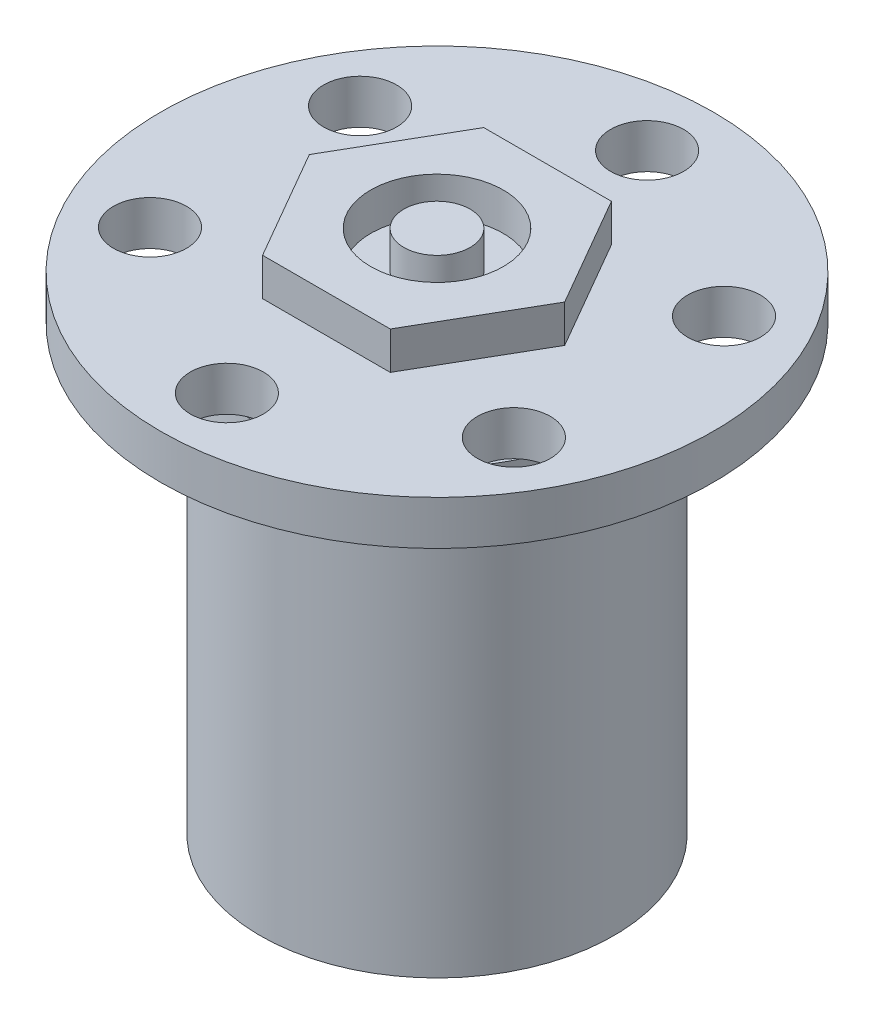
ISO-10303-21;
HEADER;
FILE_DESCRIPTION(('STEP AP214'),'2;1');
FILE_NAME('part.step','',(''),(''),'','','');
FILE_SCHEMA(('AUTOMOTIVE_DESIGN { 1 0 10303 214 1 1 1 1 }'));
ENDSEC;
DATA;
#1=APPLICATION_CONTEXT('core data for automotive mechanical design processes');
#2=APPLICATION_PROTOCOL_DEFINITION('international standard','automotive_design',2000,#1);
#3=PRODUCT_CONTEXT('',#1,'mechanical');
#4=PRODUCT('Part','Part','',(#3));
#5=PRODUCT_RELATED_PRODUCT_CATEGORY('part','',(#4));
#6=PRODUCT_DEFINITION_FORMATION('','',#4);
#7=PRODUCT_DEFINITION_CONTEXT('part definition',#1,'design');
#8=PRODUCT_DEFINITION('design','',#6,#7);
#9=PRODUCT_DEFINITION_SHAPE('','',#8);
#10=(LENGTH_UNIT() NAMED_UNIT(*) SI_UNIT(.MILLI.,.METRE.));
#11=(NAMED_UNIT(*) PLANE_ANGLE_UNIT() SI_UNIT($,.RADIAN.));
#12=(NAMED_UNIT(*) SI_UNIT($,.STERADIAN.) SOLID_ANGLE_UNIT());
#13=UNCERTAINTY_MEASURE_WITH_UNIT(LENGTH_MEASURE(1.E-05),#10,'distance_accuracy_value','');
#14=(GEOMETRIC_REPRESENTATION_CONTEXT(3) GLOBAL_UNCERTAINTY_ASSIGNED_CONTEXT((#13)) GLOBAL_UNIT_ASSIGNED_CONTEXT((#10,
#11,#12)) REPRESENTATION_CONTEXT('',''));
#15=CARTESIAN_POINT('',(0.,0.,0.));
#16=DIRECTION('',(0.,0.,1.));
#17=DIRECTION('',(1.,0.,0.));
#18=AXIS2_PLACEMENT_3D('',#15,#16,#17);
#19=CARTESIAN_POINT('',(0.,2.,0.));
#20=DIRECTION('',(0.,-1.,0.));
#21=DIRECTION('',(0.,0.,-1.));
#22=AXIS2_PLACEMENT_3D('',#19,#20,#21);
#23=CYLINDRICAL_SURFACE('',#22,12.5);
#24=CARTESIAN_POINT('',(0.,2.,0.));
#25=DIRECTION('',(0.,1.,0.));
#26=DIRECTION('',(0.,0.,1.));
#27=AXIS2_PLACEMENT_3D('',#24,#25,#26);
#28=CIRCLE('',#27,12.5);
#29=CARTESIAN_POINT('',(0.,2.,12.5));
#30=VERTEX_POINT('',#29);
#31=EDGE_CURVE('E201',#30,#30,#28,.T.);
#32=ORIENTED_EDGE('',*,*,#31,.F.);
#33=EDGE_LOOP('',(#32));
#34=FACE_BOUND('',#33,.T.);
#35=CARTESIAN_POINT('',(0.,0.,0.));
#36=DIRECTION('',(0.,1.,0.));
#37=DIRECTION('',(0.,0.,1.));
#38=AXIS2_PLACEMENT_3D('',#35,#36,#37);
#39=CIRCLE('',#38,12.5);
#40=CARTESIAN_POINT('',(0.,0.,12.5));
#41=VERTEX_POINT('',#40);
#42=EDGE_CURVE('E39',#41,#41,#39,.T.);
#43=ORIENTED_EDGE('',*,*,#42,.T.);
#44=EDGE_LOOP('',(#43));
#45=FACE_BOUND('',#44,.T.);
#46=ADVANCED_FACE('F36',(#34,#45),#23,.T.);
#47=CARTESIAN_POINT('',(0.,2.,0.));
#48=DIRECTION('',(0.,1.,0.));
#49=DIRECTION('',(0.,0.,1.));
#50=AXIS2_PLACEMENT_3D('',#47,#48,#49);
#51=PLANE('',#50);
#52=DIRECTION('',(-0.5,0.,0.866025403784439));
#53=VECTOR('',#52,1.);
#54=CARTESIAN_POINT('',(-2.88675134594813,2.,-5.));
#55=LINE('',#54,#53);
#56=CARTESIAN_POINT('',(-2.88675134594813,2.,-5.));
#57=VERTEX_POINT('',#56);
#58=CARTESIAN_POINT('',(-5.77350269189626,2.,0.));
#59=VERTEX_POINT('',#58);
#60=EDGE_CURVE('E53',#57,#59,#55,.T.);
#61=ORIENTED_EDGE('',*,*,#60,.F.);
#62=DIRECTION('',(-1.,0.,0.));
#63=VECTOR('',#62,1.);
#64=CARTESIAN_POINT('',(2.88675134594813,2.,-5.));
#65=LINE('',#64,#63);
#66=CARTESIAN_POINT('',(2.88675134594813,2.,-5.));
#67=VERTEX_POINT('',#66);
#68=EDGE_CURVE('E57',#67,#57,#65,.T.);
#69=ORIENTED_EDGE('',*,*,#68,.F.);
#70=DIRECTION('',(-0.5,0.,-0.866025403784439));
#71=VECTOR('',#70,1.);
#72=CARTESIAN_POINT('',(5.77350269189626,2.,0.));
#73=LINE('',#72,#71);
#74=CARTESIAN_POINT('',(5.77350269189626,2.,0.));
#75=VERTEX_POINT('',#74);
#76=EDGE_CURVE('E565',#75,#67,#73,.T.);
#77=ORIENTED_EDGE('',*,*,#76,.F.);
#78=DIRECTION('',(0.5,0.,-0.866025403784439));
#79=VECTOR('',#78,1.);
#80=CARTESIAN_POINT('',(2.88675134594813,2.,5.));
#81=LINE('',#80,#79);
#82=CARTESIAN_POINT('',(2.88675134594813,2.,5.));
#83=VERTEX_POINT('',#82);
#84=EDGE_CURVE('E562',#83,#75,#81,.T.);
#85=ORIENTED_EDGE('',*,*,#84,.F.);
#86=DIRECTION('',(1.,0.,0.));
#87=VECTOR('',#86,1.);
#88=CARTESIAN_POINT('',(-2.88675134594813,2.,5.));
#89=LINE('',#88,#87);
#90=CARTESIAN_POINT('',(-2.88675134594813,2.,5.));
#91=VERTEX_POINT('',#90);
#92=EDGE_CURVE('E559',#91,#83,#89,.T.);
#93=ORIENTED_EDGE('',*,*,#92,.F.);
#94=DIRECTION('',(0.5,0.,0.866025403784439));
#95=VECTOR('',#94,1.);
#96=CARTESIAN_POINT('',(-5.77350269189626,2.,0.));
#97=LINE('',#96,#95);
#98=EDGE_CURVE('E557',#59,#91,#97,.T.);
#99=ORIENTED_EDGE('',*,*,#98,.F.);
#100=EDGE_LOOP('',(#61,#69,#77,#85,#93,#99));
#101=FACE_BOUND('',#100,.T.);
#102=CARTESIAN_POINT('',(8.22724133595211,2.,-4.7500000000001));
#103=DIRECTION('',(0.,-1.,0.));
#104=DIRECTION('',(0.866025403784433,0.,-0.50000000000001));
#105=AXIS2_PLACEMENT_3D('',#102,#103,#104);
#106=CIRCLE('',#105,1.65);
#107=CARTESIAN_POINT('',(9.65618325219643,2.,-5.57500000000011));
#108=VERTEX_POINT('',#107);
#109=EDGE_CURVE('E184',#108,#108,#106,.T.);
#110=ORIENTED_EDGE('',*,*,#109,.T.);
#111=EDGE_LOOP('',(#110));
#112=FACE_BOUND('',#111,.T.);
#113=CARTESIAN_POINT('',(8.22724133595221,2.,4.74999999999992));
#114=DIRECTION('',(0.,-1.,0.));
#115=DIRECTION('',(0.866025403784443,0.,0.499999999999992));
#116=AXIS2_PLACEMENT_3D('',#113,#114,#115);
#117=CIRCLE('',#116,1.65);
#118=CARTESIAN_POINT('',(9.65618325219654,2.,5.57499999999991));
#119=VERTEX_POINT('',#118);
#120=EDGE_CURVE('E177',#119,#119,#117,.T.);
#121=ORIENTED_EDGE('',*,*,#120,.T.);
#122=EDGE_LOOP('',(#121));
#123=FACE_BOUND('',#122,.T.);
#124=CARTESIAN_POINT('',(0.,2.,9.5));
#125=DIRECTION('',(0.,-1.,0.));
#126=DIRECTION('',(0.,0.,1.));
#127=AXIS2_PLACEMENT_3D('',#124,#125,#126);
#128=CIRCLE('',#127,1.65);
#129=CARTESIAN_POINT('',(0.,2.,11.15));
#130=VERTEX_POINT('',#129);
#131=EDGE_CURVE('E170',#130,#130,#128,.T.);
#132=ORIENTED_EDGE('',*,*,#131,.T.);
#133=EDGE_LOOP('',(#132));
#134=FACE_BOUND('',#133,.T.);
#135=CARTESIAN_POINT('',(-8.22724133595215,2.,4.75000000000004));
#136=DIRECTION('',(0.,-1.,0.));
#137=DIRECTION('',(-0.866025403784436,0.,0.500000000000004));
#138=AXIS2_PLACEMENT_3D('',#135,#136,#137);
#139=CIRCLE('',#138,1.65);
#140=CARTESIAN_POINT('',(-9.65618325219647,2.,5.57500000000005));
#141=VERTEX_POINT('',#140);
#142=EDGE_CURVE('E162',#141,#141,#139,.T.);
#143=ORIENTED_EDGE('',*,*,#142,.T.);
#144=EDGE_LOOP('',(#143));
#145=FACE_BOUND('',#144,.T.);
#146=CARTESIAN_POINT('',(-8.22724133595218,2.,-4.74999999999998));
#147=DIRECTION('',(0.,-1.,0.));
#148=DIRECTION('',(-0.86602540378444,0.,-0.499999999999998));
#149=AXIS2_PLACEMENT_3D('',#146,#147,#148);
#150=CIRCLE('',#149,1.65);
#151=CARTESIAN_POINT('',(-9.6561832521965,2.,-5.57499999999998));
#152=VERTEX_POINT('',#151);
#153=EDGE_CURVE('E190',#152,#152,#150,.T.);
#154=ORIENTED_EDGE('',*,*,#153,.T.);
#155=EDGE_LOOP('',(#154));
#156=FACE_BOUND('',#155,.T.);
#157=CARTESIAN_POINT('',(0.,2.,-9.5));
#158=DIRECTION('',(0.,-1.,0.));
#159=DIRECTION('',(0.,0.,-1.));
#160=AXIS2_PLACEMENT_3D('',#157,#158,#159);
#161=CIRCLE('',#160,1.65);
#162=CARTESIAN_POINT('',(0.,2.,-11.15));
#163=VERTEX_POINT('',#162);
#164=EDGE_CURVE('E197',#163,#163,#161,.T.);
#165=ORIENTED_EDGE('',*,*,#164,.T.);
#166=EDGE_LOOP('',(#165));
#167=FACE_BOUND('',#166,.T.);
#168=ORIENTED_EDGE('',*,*,#31,.T.);
#169=EDGE_LOOP('',(#168));
#170=FACE_BOUND('',#169,.T.);
#171=ADVANCED_FACE('F214',(#101,#112,#123,#134,#145,#156,#167,#170),#51,.T.);
#172=CARTESIAN_POINT('',(0.,0.,0.));
#173=DIRECTION('',(0.,1.,0.));
#174=DIRECTION('',(0.,0.,1.));
#175=AXIS2_PLACEMENT_3D('',#172,#173,#174);
#176=PLANE('',#175);
#177=CARTESIAN_POINT('',(0.,0.,0.));
#178=DIRECTION('',(0.,-1.,0.));
#179=DIRECTION('',(0.,0.,-1.));
#180=AXIS2_PLACEMENT_3D('',#177,#178,#179);
#181=CIRCLE('',#180,8.);
#182=CARTESIAN_POINT('',(0.630298578831062,0.,-7.97513157894737));
#183=VERTEX_POINT('',#182);
#184=CARTESIAN_POINT('',(6.59151725647634,0.,-4.53342037071069));
#185=VERTEX_POINT('',#184);
#186=EDGE_CURVE('E151',#183,#185,#181,.T.);
#187=ORIENTED_EDGE('',*,*,#186,.F.);
#188=CARTESIAN_POINT('',(0.,0.,-9.5));
#189=DIRECTION('',(0.,-1.,0.));
#190=DIRECTION('',(0.,0.,-1.));
#191=AXIS2_PLACEMENT_3D('',#188,#189,#190);
#192=CIRCLE('',#191,1.65);
#193=CARTESIAN_POINT('',(-0.630298578831062,0.,-7.97513157894737));
#194=VERTEX_POINT('',#193);
#195=EDGE_CURVE('E193',#194,#183,#192,.T.);
#196=ORIENTED_EDGE('',*,*,#195,.F.);
#197=CARTESIAN_POINT('',(-6.5915172564764,0.,-4.5334203707106));
#198=VERTEX_POINT('',#197);
#199=EDGE_CURVE('E161',#198,#194,#181,.T.);
#200=ORIENTED_EDGE('',*,*,#199,.F.);
#201=CARTESIAN_POINT('',(-8.22724133595218,0.,-4.74999999999998));
#202=DIRECTION('',(0.,-1.,0.));
#203=DIRECTION('',(-0.86602540378444,0.,-0.499999999999998));
#204=AXIS2_PLACEMENT_3D('',#201,#202,#203);
#205=CIRCLE('',#204,1.65);
#206=CARTESIAN_POINT('',(-7.22181583530746,0.,-3.44171120823674));
#207=VERTEX_POINT('',#206);
#208=EDGE_CURVE('E165',#207,#198,#205,.T.);
#209=ORIENTED_EDGE('',*,*,#208,.F.);
#210=CARTESIAN_POINT('',(-7.22181583530744,0.,3.44171120823679));
#211=VERTEX_POINT('',#210);
#212=EDGE_CURVE('E206',#211,#207,#181,.T.);
#213=ORIENTED_EDGE('',*,*,#212,.F.);
#214=CARTESIAN_POINT('',(-8.22724133595215,0.,4.75000000000004));
#215=DIRECTION('',(0.,-1.,0.));
#216=DIRECTION('',(-0.866025403784436,0.,0.500000000000004));
#217=AXIS2_PLACEMENT_3D('',#214,#215,#216);
#218=CIRCLE('',#217,1.65);
#219=CARTESIAN_POINT('',(-6.59151725647637,0.,4.53342037071064));
#220=VERTEX_POINT('',#219);
#221=EDGE_CURVE('E169',#220,#211,#218,.T.);
#222=ORIENTED_EDGE('',*,*,#221,.F.);
#223=CARTESIAN_POINT('',(-0.630298578831062,0.,7.97513157894737));
#224=VERTEX_POINT('',#223);
#225=EDGE_CURVE('E395',#224,#220,#181,.T.);
#226=ORIENTED_EDGE('',*,*,#225,.F.);
#227=CARTESIAN_POINT('',(0.,0.,9.5));
#228=DIRECTION('',(0.,-1.,0.));
#229=DIRECTION('',(0.,0.,1.));
#230=AXIS2_PLACEMENT_3D('',#227,#228,#229);
#231=CIRCLE('',#230,1.65);
#232=CARTESIAN_POINT('',(0.630298578831062,0.,7.97513157894737));
#233=VERTEX_POINT('',#232);
#234=EDGE_CURVE('E176',#233,#224,#231,.T.);
#235=ORIENTED_EDGE('',*,*,#234,.F.);
#236=CARTESIAN_POINT('',(6.59151725647643,0.,4.53342037071055));
#237=VERTEX_POINT('',#236);
#238=EDGE_CURVE('E44',#237,#233,#181,.T.);
#239=ORIENTED_EDGE('',*,*,#238,.F.);
#240=CARTESIAN_POINT('',(8.22724133595221,0.,4.74999999999992));
#241=DIRECTION('',(0.,-1.,0.));
#242=DIRECTION('',(0.866025403784443,0.,0.499999999999992));
#243=AXIS2_PLACEMENT_3D('',#240,#241,#242);
#244=CIRCLE('',#243,1.65);
#245=CARTESIAN_POINT('',(7.22181583530749,0.,3.44171120823669));
#246=VERTEX_POINT('',#245);
#247=EDGE_CURVE('E183',#246,#237,#244,.T.);
#248=ORIENTED_EDGE('',*,*,#247,.F.);
#249=CARTESIAN_POINT('',(7.22181583530741,0.,-3.44171120823684));
#250=VERTEX_POINT('',#249);
#251=EDGE_CURVE('E11',#250,#246,#181,.T.);
#252=ORIENTED_EDGE('',*,*,#251,.F.);
#253=CARTESIAN_POINT('',(8.22724133595211,0.,-4.7500000000001));
#254=DIRECTION('',(0.,-1.,0.));
#255=DIRECTION('',(0.866025403784433,0.,-0.50000000000001));
#256=AXIS2_PLACEMENT_3D('',#253,#254,#255);
#257=CIRCLE('',#256,1.65);
#258=EDGE_CURVE('E158',#185,#250,#257,.T.);
#259=ORIENTED_EDGE('',*,*,#258,.F.);
#260=EDGE_LOOP('',(#187,#196,#200,#209,#213,#222,#226,#235,#239,#248,#252,#259));
#261=FACE_BOUND('',#260,.T.);
#262=ORIENTED_EDGE('',*,*,#42,.F.);
#263=EDGE_LOOP('',(#262));
#264=FACE_BOUND('',#263,.T.);
#265=ADVANCED_FACE('F211',(#261,#264),#176,.F.);
#266=CARTESIAN_POINT('',(0.,2.,-9.5));
#267=DIRECTION('',(0.,-1.,0.));
#268=DIRECTION('',(0.,0.,-1.));
#269=AXIS2_PLACEMENT_3D('',#266,#267,#268);
#270=CYLINDRICAL_SURFACE('',#269,1.65);
#271=ORIENTED_EDGE('',*,*,#164,.F.);
#272=EDGE_LOOP('',(#271));
#273=FACE_BOUND('',#272,.T.);
#274=EDGE_CURVE('E200',#183,#194,#192,.T.);
#275=ORIENTED_EDGE('',*,*,#274,.T.);
#276=ORIENTED_EDGE('',*,*,#195,.T.);
#277=EDGE_LOOP('',(#275,#276));
#278=FACE_BOUND('',#277,.T.);
#279=ADVANCED_FACE('F213',(#273,#278),#270,.F.);
#280=CARTESIAN_POINT('',(-8.22724133595218,2.,-4.74999999999998));
#281=DIRECTION('',(0.,-1.,0.));
#282=DIRECTION('',(0.,0.,-1.));
#283=AXIS2_PLACEMENT_3D('',#280,#281,#282);
#284=CYLINDRICAL_SURFACE('',#283,1.65);
#285=ORIENTED_EDGE('',*,*,#153,.F.);
#286=EDGE_LOOP('',(#285));
#287=FACE_BOUND('',#286,.T.);
#288=EDGE_CURVE('E194',#198,#207,#205,.T.);
#289=ORIENTED_EDGE('',*,*,#288,.T.);
#290=ORIENTED_EDGE('',*,*,#208,.T.);
#291=EDGE_LOOP('',(#289,#290));
#292=FACE_BOUND('',#291,.T.);
#293=ADVANCED_FACE('F220',(#287,#292),#284,.F.);
#294=CARTESIAN_POINT('',(-8.22724133595215,2.,4.75000000000004));
#295=DIRECTION('',(0.,-1.,0.));
#296=DIRECTION('',(0.,0.,-1.));
#297=AXIS2_PLACEMENT_3D('',#294,#295,#296);
#298=CYLINDRICAL_SURFACE('',#297,1.65);
#299=ORIENTED_EDGE('',*,*,#142,.F.);
#300=EDGE_LOOP('',(#299));
#301=FACE_BOUND('',#300,.T.);
#302=EDGE_CURVE('E166',#211,#220,#218,.T.);
#303=ORIENTED_EDGE('',*,*,#302,.T.);
#304=ORIENTED_EDGE('',*,*,#221,.T.);
#305=EDGE_LOOP('',(#303,#304));
#306=FACE_BOUND('',#305,.T.);
#307=ADVANCED_FACE('F361',(#301,#306),#298,.F.);
#308=CARTESIAN_POINT('',(0.,2.,9.5));
#309=DIRECTION('',(0.,-1.,0.));
#310=DIRECTION('',(0.,0.,-1.));
#311=AXIS2_PLACEMENT_3D('',#308,#309,#310);
#312=CYLINDRICAL_SURFACE('',#311,1.65);
#313=ORIENTED_EDGE('',*,*,#131,.F.);
#314=EDGE_LOOP('',(#313));
#315=FACE_BOUND('',#314,.T.);
#316=EDGE_CURVE('E173',#224,#233,#231,.T.);
#317=ORIENTED_EDGE('',*,*,#316,.T.);
#318=ORIENTED_EDGE('',*,*,#234,.T.);
#319=EDGE_LOOP('',(#317,#318));
#320=FACE_BOUND('',#319,.T.);
#321=ADVANCED_FACE('F364',(#315,#320),#312,.F.);
#322=CARTESIAN_POINT('',(8.22724133595221,2.,4.74999999999992));
#323=DIRECTION('',(0.,-1.,0.));
#324=DIRECTION('',(0.,0.,-1.));
#325=AXIS2_PLACEMENT_3D('',#322,#323,#324);
#326=CYLINDRICAL_SURFACE('',#325,1.65);
#327=ORIENTED_EDGE('',*,*,#120,.F.);
#328=EDGE_LOOP('',(#327));
#329=FACE_BOUND('',#328,.T.);
#330=EDGE_CURVE('E180',#237,#246,#244,.T.);
#331=ORIENTED_EDGE('',*,*,#330,.T.);
#332=ORIENTED_EDGE('',*,*,#247,.T.);
#333=EDGE_LOOP('',(#331,#332));
#334=FACE_BOUND('',#333,.T.);
#335=ADVANCED_FACE('F368',(#329,#334),#326,.F.);
#336=CARTESIAN_POINT('',(8.22724133595211,2.,-4.7500000000001));
#337=DIRECTION('',(0.,-1.,0.));
#338=DIRECTION('',(0.,0.,-1.));
#339=AXIS2_PLACEMENT_3D('',#336,#337,#338);
#340=CYLINDRICAL_SURFACE('',#339,1.65);
#341=ORIENTED_EDGE('',*,*,#109,.F.);
#342=EDGE_LOOP('',(#341));
#343=FACE_BOUND('',#342,.T.);
#344=EDGE_CURVE('E187',#250,#185,#257,.T.);
#345=ORIENTED_EDGE('',*,*,#344,.T.);
#346=ORIENTED_EDGE('',*,*,#258,.T.);
#347=EDGE_LOOP('',(#345,#346));
#348=FACE_BOUND('',#347,.T.);
#349=ADVANCED_FACE('F372',(#343,#348),#340,.F.);
#350=CARTESIAN_POINT('',(0.,0.,0.));
#351=DIRECTION('',(0.,-1.,0.));
#352=DIRECTION('',(0.,0.,-1.));
#353=AXIS2_PLACEMENT_3D('',#350,#351,#352);
#354=PLANE('',#353);
#355=ORIENTED_EDGE('',*,*,#344,.F.);
#356=EDGE_CURVE('E46',#185,#250,#181,.T.);
#357=ORIENTED_EDGE('',*,*,#356,.F.);
#358=EDGE_LOOP('',(#355,#357));
#359=FACE_BOUND('',#358,.T.);
#360=ADVANCED_FACE('F356',(#359),#354,.F.);
#361=ORIENTED_EDGE('',*,*,#330,.F.);
#362=EDGE_CURVE('E402',#246,#237,#181,.T.);
#363=ORIENTED_EDGE('',*,*,#362,.F.);
#364=EDGE_LOOP('',(#361,#363));
#365=FACE_BOUND('',#364,.T.);
#366=ADVANCED_FACE('F408',(#365),#354,.F.);
#367=ORIENTED_EDGE('',*,*,#316,.F.);
#368=EDGE_CURVE('E400',#233,#224,#181,.T.);
#369=ORIENTED_EDGE('',*,*,#368,.F.);
#370=EDGE_LOOP('',(#367,#369));
#371=FACE_BOUND('',#370,.T.);
#372=ADVANCED_FACE('F424',(#371),#354,.F.);
#373=ORIENTED_EDGE('',*,*,#302,.F.);
#374=EDGE_CURVE('E390',#220,#211,#181,.T.);
#375=ORIENTED_EDGE('',*,*,#374,.F.);
#376=EDGE_LOOP('',(#373,#375));
#377=FACE_BOUND('',#376,.T.);
#378=ADVANCED_FACE('F428',(#377),#354,.F.);
#379=ORIENTED_EDGE('',*,*,#288,.F.);
#380=EDGE_CURVE('E150',#207,#198,#181,.T.);
#381=ORIENTED_EDGE('',*,*,#380,.F.);
#382=EDGE_LOOP('',(#379,#381));
#383=FACE_BOUND('',#382,.T.);
#384=ADVANCED_FACE('F357',(#383),#354,.F.);
#385=CARTESIAN_POINT('',(0.,-20.,0.));
#386=DIRECTION('',(0.,1.,0.));
#387=DIRECTION('',(0.,0.,1.));
#388=AXIS2_PLACEMENT_3D('',#385,#386,#387);
#389=CYLINDRICAL_SURFACE('',#388,8.);
#390=CARTESIAN_POINT('',(0.,-20.,0.));
#391=DIRECTION('',(0.,-1.,0.));
#392=DIRECTION('',(0.,0.,-1.));
#393=AXIS2_PLACEMENT_3D('',#390,#391,#392);
#394=CIRCLE('',#393,8.);
#395=CARTESIAN_POINT('',(0.,-20.,-8.));
#396=VERTEX_POINT('',#395);
#397=EDGE_CURVE('E156',#396,#396,#394,.T.);
#398=ORIENTED_EDGE('',*,*,#397,.F.);
#399=EDGE_LOOP('',(#398));
#400=FACE_BOUND('',#399,.T.);
#401=ORIENTED_EDGE('',*,*,#186,.T.);
#402=ORIENTED_EDGE('',*,*,#356,.T.);
#403=ORIENTED_EDGE('',*,*,#251,.T.);
#404=ORIENTED_EDGE('',*,*,#362,.T.);
#405=ORIENTED_EDGE('',*,*,#238,.T.);
#406=ORIENTED_EDGE('',*,*,#368,.T.);
#407=ORIENTED_EDGE('',*,*,#225,.T.);
#408=ORIENTED_EDGE('',*,*,#374,.T.);
#409=ORIENTED_EDGE('',*,*,#212,.T.);
#410=ORIENTED_EDGE('',*,*,#380,.T.);
#411=ORIENTED_EDGE('',*,*,#199,.T.);
#412=EDGE_CURVE('E147',#194,#183,#181,.T.);
#413=ORIENTED_EDGE('',*,*,#412,.T.);
#414=EDGE_LOOP('',(#401,#402,#403,#404,#405,#406,#407,#408,#409,#410,#411,#413));
#415=FACE_BOUND('',#414,.T.);
#416=ADVANCED_FACE('F352',(#400,#415),#389,.T.);
#417=CARTESIAN_POINT('',(0.,-20.,0.));
#418=DIRECTION('',(0.,-1.,0.));
#419=DIRECTION('',(0.,0.,-1.));
#420=AXIS2_PLACEMENT_3D('',#417,#418,#419);
#421=PLANE('',#420);
#422=ORIENTED_EDGE('',*,*,#397,.T.);
#423=EDGE_LOOP('',(#422));
#424=FACE_BOUND('',#423,.T.);
#425=ADVANCED_FACE('F349',(#424),#421,.T.);
#426=ORIENTED_EDGE('',*,*,#274,.F.);
#427=ORIENTED_EDGE('',*,*,#412,.F.);
#428=EDGE_LOOP('',(#426,#427));
#429=FACE_BOUND('',#428,.T.);
#430=ADVANCED_FACE('F239',(#429),#354,.F.);
#431=CARTESIAN_POINT('',(-2.88675134594813,3.7,-5.));
#432=DIRECTION('',(0.866025403784439,0.,0.5));
#433=DIRECTION('',(0.5,0.,-0.866025403784439));
#434=AXIS2_PLACEMENT_3D('',#431,#432,#433);
#435=PLANE('',#434);
#436=ORIENTED_EDGE('',*,*,#60,.T.);
#437=DIRECTION('',(0.,-1.,0.));
#438=VECTOR('',#437,1.);
#439=CARTESIAN_POINT('',(-5.77350269189626,3.7,0.));
#440=LINE('',#439,#438);
#441=CARTESIAN_POINT('',(-5.77350269189626,3.7,0.));
#442=VERTEX_POINT('',#441);
#443=EDGE_CURVE('E130',#442,#59,#440,.T.);
#444=ORIENTED_EDGE('',*,*,#443,.F.);
#445=DIRECTION('',(-0.5,0.,0.866025403784439));
#446=VECTOR('',#445,1.);
#447=CARTESIAN_POINT('',(-2.88675134594813,3.7,-5.));
#448=LINE('',#447,#446);
#449=CARTESIAN_POINT('',(-2.88675134594813,3.7,-5.));
#450=VERTEX_POINT('',#449);
#451=EDGE_CURVE('E136',#450,#442,#448,.T.);
#452=ORIENTED_EDGE('',*,*,#451,.F.);
#453=DIRECTION('',(0.,-1.,0.));
#454=VECTOR('',#453,1.);
#455=CARTESIAN_POINT('',(-2.88675134594813,3.7,-5.));
#456=LINE('',#455,#454);
#457=EDGE_CURVE('E555',#450,#57,#456,.T.);
#458=ORIENTED_EDGE('',*,*,#457,.T.);
#459=EDGE_LOOP('',(#436,#444,#452,#458));
#460=FACE_BOUND('',#459,.T.);
#461=ADVANCED_FACE('F146',(#460),#435,.F.);
#462=CARTESIAN_POINT('',(-5.77350269189626,3.7,0.));
#463=DIRECTION('',(0.866025403784439,0.,-0.5));
#464=DIRECTION('',(-0.5,0.,-0.866025403784439));
#465=AXIS2_PLACEMENT_3D('',#462,#463,#464);
#466=PLANE('',#465);
#467=ORIENTED_EDGE('',*,*,#98,.T.);
#468=DIRECTION('',(0.,-1.,0.));
#469=VECTOR('',#468,1.);
#470=CARTESIAN_POINT('',(-2.88675134594813,3.7,5.));
#471=LINE('',#470,#469);
#472=CARTESIAN_POINT('',(-2.88675134594813,3.7,5.));
#473=VERTEX_POINT('',#472);
#474=EDGE_CURVE('E132',#473,#91,#471,.T.);
#475=ORIENTED_EDGE('',*,*,#474,.F.);
#476=DIRECTION('',(0.5,0.,0.866025403784439));
#477=VECTOR('',#476,1.);
#478=CARTESIAN_POINT('',(-5.77350269189626,3.7,0.));
#479=LINE('',#478,#477);
#480=EDGE_CURVE('E125',#442,#473,#479,.T.);
#481=ORIENTED_EDGE('',*,*,#480,.F.);
#482=ORIENTED_EDGE('',*,*,#443,.T.);
#483=EDGE_LOOP('',(#467,#475,#481,#482));
#484=FACE_BOUND('',#483,.T.);
#485=ADVANCED_FACE('F128',(#484),#466,.F.);
#486=CARTESIAN_POINT('',(-2.88675134594813,3.7,5.));
#487=DIRECTION('',(0.,0.,-1.));
#488=DIRECTION('',(-1.,0.,0.));
#489=AXIS2_PLACEMENT_3D('',#486,#487,#488);
#490=PLANE('',#489);
#491=ORIENTED_EDGE('',*,*,#92,.T.);
#492=DIRECTION('',(0.,-1.,0.));
#493=VECTOR('',#492,1.);
#494=CARTESIAN_POINT('',(2.88675134594813,3.7,5.));
#495=LINE('',#494,#493);
#496=CARTESIAN_POINT('',(2.88675134594813,3.7,5.));
#497=VERTEX_POINT('',#496);
#498=EDGE_CURVE('E152',#497,#83,#495,.T.);
#499=ORIENTED_EDGE('',*,*,#498,.F.);
#500=DIRECTION('',(1.,0.,0.));
#501=VECTOR('',#500,1.);
#502=CARTESIAN_POINT('',(-2.88675134594813,3.7,5.));
#503=LINE('',#502,#501);
#504=EDGE_CURVE('E135',#473,#497,#503,.T.);
#505=ORIENTED_EDGE('',*,*,#504,.F.);
#506=ORIENTED_EDGE('',*,*,#474,.T.);
#507=EDGE_LOOP('',(#491,#499,#505,#506));
#508=FACE_BOUND('',#507,.T.);
#509=ADVANCED_FACE('F256',(#508),#490,.F.);
#510=CARTESIAN_POINT('',(2.88675134594813,3.7,5.));
#511=DIRECTION('',(-0.866025403784439,0.,-0.5));
#512=DIRECTION('',(-0.5,0.,0.866025403784439));
#513=AXIS2_PLACEMENT_3D('',#510,#511,#512);
#514=PLANE('',#513);
#515=ORIENTED_EDGE('',*,*,#84,.T.);
#516=DIRECTION('',(0.,-1.,0.));
#517=VECTOR('',#516,1.);
#518=CARTESIAN_POINT('',(5.77350269189626,3.7,0.));
#519=LINE('',#518,#517);
#520=CARTESIAN_POINT('',(5.77350269189626,3.7,0.));
#521=VERTEX_POINT('',#520);
#522=EDGE_CURVE('E572',#521,#75,#519,.T.);
#523=ORIENTED_EDGE('',*,*,#522,.F.);
#524=DIRECTION('',(0.5,0.,-0.866025403784439));
#525=VECTOR('',#524,1.);
#526=CARTESIAN_POINT('',(2.88675134594813,3.7,5.));
#527=LINE('',#526,#525);
#528=EDGE_CURVE('E550',#497,#521,#527,.T.);
#529=ORIENTED_EDGE('',*,*,#528,.F.);
#530=ORIENTED_EDGE('',*,*,#498,.T.);
#531=EDGE_LOOP('',(#515,#523,#529,#530));
#532=FACE_BOUND('',#531,.T.);
#533=ADVANCED_FACE('F265',(#532),#514,.F.);
#534=CARTESIAN_POINT('',(5.77350269189626,3.7,0.));
#535=DIRECTION('',(-0.866025403784439,0.,0.5));
#536=DIRECTION('',(0.5,0.,0.866025403784439));
#537=AXIS2_PLACEMENT_3D('',#534,#535,#536);
#538=PLANE('',#537);
#539=ORIENTED_EDGE('',*,*,#76,.T.);
#540=DIRECTION('',(0.,-1.,0.));
#541=VECTOR('',#540,1.);
#542=CARTESIAN_POINT('',(2.88675134594813,3.7,-5.));
#543=LINE('',#542,#541);
#544=CARTESIAN_POINT('',(2.88675134594813,3.7,-5.));
#545=VERTEX_POINT('',#544);
#546=EDGE_CURVE('E569',#545,#67,#543,.T.);
#547=ORIENTED_EDGE('',*,*,#546,.F.);
#548=DIRECTION('',(-0.5,0.,-0.866025403784439));
#549=VECTOR('',#548,1.);
#550=CARTESIAN_POINT('',(5.77350269189626,3.7,0.));
#551=LINE('',#550,#549);
#552=EDGE_CURVE('E552',#521,#545,#551,.T.);
#553=ORIENTED_EDGE('',*,*,#552,.F.);
#554=ORIENTED_EDGE('',*,*,#522,.T.);
#555=EDGE_LOOP('',(#539,#547,#553,#554));
#556=FACE_BOUND('',#555,.T.);
#557=ADVANCED_FACE('F275',(#556),#538,.F.);
#558=CARTESIAN_POINT('',(2.88675134594813,3.7,-5.));
#559=DIRECTION('',(0.,0.,1.));
#560=DIRECTION('',(1.,0.,0.));
#561=AXIS2_PLACEMENT_3D('',#558,#559,#560);
#562=PLANE('',#561);
#563=ORIENTED_EDGE('',*,*,#68,.T.);
#564=ORIENTED_EDGE('',*,*,#457,.F.);
#565=DIRECTION('',(-1.,0.,0.));
#566=VECTOR('',#565,1.);
#567=CARTESIAN_POINT('',(2.88675134594813,3.7,-5.));
#568=LINE('',#567,#566);
#569=EDGE_CURVE('E141',#545,#450,#568,.T.);
#570=ORIENTED_EDGE('',*,*,#569,.F.);
#571=ORIENTED_EDGE('',*,*,#546,.T.);
#572=EDGE_LOOP('',(#563,#564,#570,#571));
#573=FACE_BOUND('',#572,.T.);
#574=ADVANCED_FACE('F285',(#573),#562,.F.);
#575=CARTESIAN_POINT('',(0.,3.7,0.));
#576=DIRECTION('',(0.,1.,0.));
#577=DIRECTION('',(0.,0.,1.));
#578=AXIS2_PLACEMENT_3D('',#575,#576,#577);
#579=PLANE('',#578);
#580=CARTESIAN_POINT('',(0.,3.7,0.));
#581=DIRECTION('',(0.,1.,0.));
#582=DIRECTION('',(0.,0.,1.));
#583=AXIS2_PLACEMENT_3D('',#580,#581,#582);
#584=CIRCLE('',#583,3.);
#585=CARTESIAN_POINT('',(0.,3.7,3.));
#586=VERTEX_POINT('',#585);
#587=EDGE_CURVE('E539',#586,#586,#584,.T.);
#588=ORIENTED_EDGE('',*,*,#587,.F.);
#589=EDGE_LOOP('',(#588));
#590=FACE_BOUND('',#589,.T.);
#591=ORIENTED_EDGE('',*,*,#451,.T.);
#592=ORIENTED_EDGE('',*,*,#480,.T.);
#593=ORIENTED_EDGE('',*,*,#504,.T.);
#594=ORIENTED_EDGE('',*,*,#528,.T.);
#595=ORIENTED_EDGE('',*,*,#552,.T.);
#596=ORIENTED_EDGE('',*,*,#569,.T.);
#597=EDGE_LOOP('',(#591,#592,#593,#594,#595,#596));
#598=FACE_BOUND('',#597,.T.);
#599=ADVANCED_FACE('F139',(#590,#598),#579,.T.);
#600=CARTESIAN_POINT('',(0.,-6.48528137423857,0.));
#601=DIRECTION('',(0.,1.,0.));
#602=DIRECTION('',(0.,0.,1.));
#603=AXIS2_PLACEMENT_3D('',#600,#601,#602);
#604=CYLINDRICAL_SURFACE('',#603,3.);
#605=CARTESIAN_POINT('',(0.,2.,0.));
#606=DIRECTION('',(0.,1.,0.));
#607=DIRECTION('',(0.,0.,1.));
#608=AXIS2_PLACEMENT_3D('',#605,#606,#607);
#609=CIRCLE('',#608,3.);
#610=CARTESIAN_POINT('',(0.,2.,3.));
#611=VERTEX_POINT('',#610);
#612=EDGE_CURVE('E542',#611,#611,#609,.F.);
#613=CARTESIAN_POINT('',(0.,2.,3.));
#614=CARTESIAN_POINT('',(0.,2.01770833333333,3.));
#615=CARTESIAN_POINT('',(0.,2.03541666666666,3.));
#616=CARTESIAN_POINT('',(0.,2.07083333333333,3.));
#617=CARTESIAN_POINT('',(0.,2.08854166666667,3.));
#618=CARTESIAN_POINT('',(0.,2.12395833333333,3.));
#619=CARTESIAN_POINT('',(0.,2.14166666666666,3.));
#620=CARTESIAN_POINT('',(0.,2.17708333333333,3.));
#621=CARTESIAN_POINT('',(0.,2.19479166666667,3.));
#622=CARTESIAN_POINT('',(0.,2.23020833333333,3.));
#623=CARTESIAN_POINT('',(0.,2.24791666666667,3.));
#624=CARTESIAN_POINT('',(0.,2.28333333333333,3.));
#625=CARTESIAN_POINT('',(0.,2.30104166666666,3.));
#626=CARTESIAN_POINT('',(0.,2.33645833333333,3.));
#627=CARTESIAN_POINT('',(0.,2.35416666666667,3.));
#628=CARTESIAN_POINT('',(0.,2.38958333333333,3.));
#629=CARTESIAN_POINT('',(0.,2.40729166666667,3.));
#630=CARTESIAN_POINT('',(0.,2.44270833333333,3.));
#631=CARTESIAN_POINT('',(0.,2.46041666666666,3.));
#632=CARTESIAN_POINT('',(0.,2.49583333333333,3.));
#633=CARTESIAN_POINT('',(0.,2.51354166666667,3.));
#634=CARTESIAN_POINT('',(0.,2.54895833333333,3.));
#635=CARTESIAN_POINT('',(0.,2.56666666666667,3.));
#636=CARTESIAN_POINT('',(0.,2.60208333333333,3.));
#637=CARTESIAN_POINT('',(0.,2.61979166666666,3.));
#638=CARTESIAN_POINT('',(0.,2.65520833333333,3.));
#639=CARTESIAN_POINT('',(0.,2.67291666666666,3.));
#640=CARTESIAN_POINT('',(0.,2.70833333333333,3.));
#641=CARTESIAN_POINT('',(0.,2.72604166666666,3.));
#642=CARTESIAN_POINT('',(0.,2.76145833333333,3.));
#643=CARTESIAN_POINT('',(0.,2.77916666666667,3.));
#644=CARTESIAN_POINT('',(0.,2.81458333333333,3.));
#645=CARTESIAN_POINT('',(0.,2.83229166666667,3.));
#646=CARTESIAN_POINT('',(0.,2.86770833333333,3.));
#647=CARTESIAN_POINT('',(0.,2.88541666666666,3.));
#648=CARTESIAN_POINT('',(0.,2.92083333333333,3.));
#649=CARTESIAN_POINT('',(0.,2.93854166666667,3.));
#650=CARTESIAN_POINT('',(0.,2.97395833333333,3.));
#651=CARTESIAN_POINT('',(0.,2.99166666666666,3.));
#652=CARTESIAN_POINT('',(0.,3.02708333333333,3.));
#653=CARTESIAN_POINT('',(0.,3.04479166666667,3.));
#654=CARTESIAN_POINT('',(0.,3.08020833333333,3.));
#655=CARTESIAN_POINT('',(0.,3.09791666666667,3.));
#656=CARTESIAN_POINT('',(0.,3.13333333333333,3.));
#657=CARTESIAN_POINT('',(0.,3.15104166666666,3.));
#658=CARTESIAN_POINT('',(0.,3.18645833333333,3.));
#659=CARTESIAN_POINT('',(0.,3.20416666666667,3.));
#660=CARTESIAN_POINT('',(0.,3.23958333333333,3.));
#661=CARTESIAN_POINT('',(0.,3.25729166666667,3.));
#662=CARTESIAN_POINT('',(0.,3.29270833333333,3.));
#663=CARTESIAN_POINT('',(0.,3.31041666666666,3.));
#664=CARTESIAN_POINT('',(0.,3.34583333333333,3.));
#665=CARTESIAN_POINT('',(0.,3.36354166666667,3.));
#666=CARTESIAN_POINT('',(0.,3.39895833333333,3.));
#667=CARTESIAN_POINT('',(0.,3.41666666666667,3.));
#668=CARTESIAN_POINT('',(0.,3.45208333333333,3.));
#669=CARTESIAN_POINT('',(0.,3.46979166666666,3.));
#670=CARTESIAN_POINT('',(0.,3.50520833333333,3.));
#671=CARTESIAN_POINT('',(0.,3.52291666666666,3.));
#672=CARTESIAN_POINT('',(0.,3.55833333333333,3.));
#673=CARTESIAN_POINT('',(0.,3.57604166666667,3.));
#674=CARTESIAN_POINT('',(0.,3.61145833333333,3.));
#675=CARTESIAN_POINT('',(0.,3.62916666666667,3.));
#676=CARTESIAN_POINT('',(0.,3.66458333333333,3.));
#677=CARTESIAN_POINT('',(0.,3.68229166666667,3.));
#678=CARTESIAN_POINT('',(0.,3.7,3.));
#679=B_SPLINE_CURVE_WITH_KNOTS('',3,(#613,#614,#615,#616,#617,#618,#619,#620,#621,#622,#623,
#624,#625,#626,#627,#628,#629,#630,#631,#632,#633,#634,#635,#636,#637,#638,#639,#640,#641,#642,
#643,#644,#645,#646,#647,#648,#649,#650,#651,#652,#653,#654,#655,#656,#657,#658,#659,#660,#661,
#662,#663,#664,#665,#666,#667,#668,#669,#670,#671,#672,#673,#674,#675,#676,#677,#678),
.UNSPECIFIED.,.F.,.F.,(4,2,2,2,2,2,2,2,2,2,2,2,2,2,2,2,2,2,2,2,2,2,2,2,2,2,2,2,2,2,2,2,4),(0.,
0.0531249999999994,0.10625,0.159375,0.212500000000001,0.265625,0.31875,0.371875000000001,0.425,
0.478124999999999,0.53125,0.584375,0.637499999999999,0.690625,0.74375,0.796875000000001,0.85,
0.903124999999999,0.95625,1.009375,1.0625,1.115625,1.16875,1.221875,1.275,1.328125,1.38125,
1.434375,1.4875,1.540625,1.59375,1.646875,1.7),.UNSPECIFIED.);
#680=EDGE_CURVE('BSEAM304',#611,#586,#679,.T.);
#681=ORIENTED_EDGE('',*,*,#612,.T.);
#682=ORIENTED_EDGE('',*,*,#587,.T.);
#683=ORIENTED_EDGE('',*,*,#680,.T.);
#684=ORIENTED_EDGE('',*,*,#680,.F.);
#685=EDGE_LOOP('',(#681,#683,#682,#684));
#686=FACE_BOUND('',#685,.T.);
#687=ADVANCED_FACE('F304',(#686),#604,.F.);
#688=CARTESIAN_POINT('',(0.,-6.48528137423857,0.));
#689=DIRECTION('',(0.,1.,0.));
#690=DIRECTION('',(0.,0.,1.));
#691=AXIS2_PLACEMENT_3D('',#688,#689,#690);
#692=CYLINDRICAL_SURFACE('',#691,1.5);
#693=CARTESIAN_POINT('',(0.,2.,0.));
#694=DIRECTION('',(0.,1.,0.));
#695=DIRECTION('',(0.,0.,1.));
#696=AXIS2_PLACEMENT_3D('',#693,#694,#695);
#697=CIRCLE('',#696,1.5);
#698=CARTESIAN_POINT('',(0.,2.,1.5));
#699=VERTEX_POINT('',#698);
#700=EDGE_CURVE('E546',#699,#699,#697,.F.);
#701=CARTESIAN_POINT('',(0.,3.7,0.));
#702=DIRECTION('',(0.,1.,0.));
#703=DIRECTION('',(0.,0.,1.));
#704=AXIS2_PLACEMENT_3D('',#701,#702,#703);
#705=CIRCLE('',#704,1.5);
#706=CARTESIAN_POINT('',(0.,3.7,1.5));
#707=VERTEX_POINT('',#706);
#708=EDGE_CURVE('E537',#707,#707,#705,.T.);
#709=CARTESIAN_POINT('',(0.,2.,1.5));
#710=CARTESIAN_POINT('',(0.,2.01770833333333,1.5));
#711=CARTESIAN_POINT('',(0.,2.03541666666666,1.5));
#712=CARTESIAN_POINT('',(0.,2.07083333333333,1.5));
#713=CARTESIAN_POINT('',(0.,2.08854166666667,1.5));
#714=CARTESIAN_POINT('',(0.,2.12395833333333,1.5));
#715=CARTESIAN_POINT('',(0.,2.14166666666666,1.5));
#716=CARTESIAN_POINT('',(0.,2.17708333333333,1.5));
#717=CARTESIAN_POINT('',(0.,2.19479166666667,1.5));
#718=CARTESIAN_POINT('',(0.,2.23020833333333,1.5));
#719=CARTESIAN_POINT('',(0.,2.24791666666667,1.5));
#720=CARTESIAN_POINT('',(0.,2.28333333333333,1.5));
#721=CARTESIAN_POINT('',(0.,2.30104166666666,1.5));
#722=CARTESIAN_POINT('',(0.,2.33645833333333,1.5));
#723=CARTESIAN_POINT('',(0.,2.35416666666667,1.5));
#724=CARTESIAN_POINT('',(0.,2.38958333333333,1.5));
#725=CARTESIAN_POINT('',(0.,2.40729166666667,1.5));
#726=CARTESIAN_POINT('',(0.,2.44270833333333,1.5));
#727=CARTESIAN_POINT('',(0.,2.46041666666666,1.5));
#728=CARTESIAN_POINT('',(0.,2.49583333333333,1.5));
#729=CARTESIAN_POINT('',(0.,2.51354166666667,1.5));
#730=CARTESIAN_POINT('',(0.,2.54895833333333,1.5));
#731=CARTESIAN_POINT('',(0.,2.56666666666667,1.5));
#732=CARTESIAN_POINT('',(0.,2.60208333333333,1.5));
#733=CARTESIAN_POINT('',(0.,2.61979166666666,1.5));
#734=CARTESIAN_POINT('',(0.,2.65520833333333,1.5));
#735=CARTESIAN_POINT('',(0.,2.67291666666666,1.5));
#736=CARTESIAN_POINT('',(0.,2.70833333333333,1.5));
#737=CARTESIAN_POINT('',(0.,2.72604166666666,1.5));
#738=CARTESIAN_POINT('',(0.,2.76145833333333,1.5));
#739=CARTESIAN_POINT('',(0.,2.77916666666667,1.5));
#740=CARTESIAN_POINT('',(0.,2.81458333333333,1.5));
#741=CARTESIAN_POINT('',(0.,2.83229166666667,1.5));
#742=CARTESIAN_POINT('',(0.,2.86770833333333,1.5));
#743=CARTESIAN_POINT('',(0.,2.88541666666666,1.5));
#744=CARTESIAN_POINT('',(0.,2.92083333333333,1.5));
#745=CARTESIAN_POINT('',(0.,2.93854166666667,1.5));
#746=CARTESIAN_POINT('',(0.,2.97395833333333,1.5));
#747=CARTESIAN_POINT('',(0.,2.99166666666666,1.5));
#748=CARTESIAN_POINT('',(0.,3.02708333333333,1.5));
#749=CARTESIAN_POINT('',(0.,3.04479166666667,1.5));
#750=CARTESIAN_POINT('',(0.,3.08020833333333,1.5));
#751=CARTESIAN_POINT('',(0.,3.09791666666667,1.5));
#752=CARTESIAN_POINT('',(0.,3.13333333333333,1.5));
#753=CARTESIAN_POINT('',(0.,3.15104166666666,1.5));
#754=CARTESIAN_POINT('',(0.,3.18645833333333,1.5));
#755=CARTESIAN_POINT('',(0.,3.20416666666667,1.5));
#756=CARTESIAN_POINT('',(0.,3.23958333333333,1.5));
#757=CARTESIAN_POINT('',(0.,3.25729166666667,1.5));
#758=CARTESIAN_POINT('',(0.,3.29270833333333,1.5));
#759=CARTESIAN_POINT('',(0.,3.31041666666666,1.5));
#760=CARTESIAN_POINT('',(0.,3.34583333333333,1.5));
#761=CARTESIAN_POINT('',(0.,3.36354166666667,1.5));
#762=CARTESIAN_POINT('',(0.,3.39895833333333,1.5));
#763=CARTESIAN_POINT('',(0.,3.41666666666667,1.5));
#764=CARTESIAN_POINT('',(0.,3.45208333333333,1.5));
#765=CARTESIAN_POINT('',(0.,3.46979166666666,1.5));
#766=CARTESIAN_POINT('',(0.,3.50520833333333,1.5));
#767=CARTESIAN_POINT('',(0.,3.52291666666666,1.5));
#768=CARTESIAN_POINT('',(0.,3.55833333333333,1.5));
#769=CARTESIAN_POINT('',(0.,3.57604166666667,1.5));
#770=CARTESIAN_POINT('',(0.,3.61145833333333,1.5));
#771=CARTESIAN_POINT('',(0.,3.62916666666667,1.5));
#772=CARTESIAN_POINT('',(0.,3.66458333333333,1.5));
#773=CARTESIAN_POINT('',(0.,3.68229166666667,1.5));
#774=CARTESIAN_POINT('',(0.,3.7,1.5));
#775=B_SPLINE_CURVE_WITH_KNOTS('',3,(#709,#710,#711,#712,#713,#714,#715,#716,#717,#718,#719,
#720,#721,#722,#723,#724,#725,#726,#727,#728,#729,#730,#731,#732,#733,#734,#735,#736,#737,#738,
#739,#740,#741,#742,#743,#744,#745,#746,#747,#748,#749,#750,#751,#752,#753,#754,#755,#756,#757,
#758,#759,#760,#761,#762,#763,#764,#765,#766,#767,#768,#769,#770,#771,#772,#773,#774),
.UNSPECIFIED.,.F.,.F.,(4,2,2,2,2,2,2,2,2,2,2,2,2,2,2,2,2,2,2,2,2,2,2,2,2,2,2,2,2,2,2,2,4),(0.,
0.0531249999999994,0.10625,0.159375,0.212500000000001,0.265625,0.31875,0.371875000000001,0.425,
0.478124999999999,0.53125,0.584375,0.637499999999999,0.690625,0.74375,0.796875000000001,0.85,
0.903124999999999,0.95625,1.009375,1.0625,1.115625,1.16875,1.221875,1.275,1.328125,1.38125,
1.434375,1.4875,1.540625,1.59375,1.646875,1.7),.UNSPECIFIED.);
#776=EDGE_CURVE('BSEAM316',#699,#707,#775,.T.);
#777=ORIENTED_EDGE('',*,*,#700,.F.);
#778=ORIENTED_EDGE('',*,*,#708,.F.);
#779=ORIENTED_EDGE('',*,*,#776,.T.);
#780=ORIENTED_EDGE('',*,*,#776,.F.);
#781=EDGE_LOOP('',(#777,#779,#778,#780));
#782=FACE_BOUND('',#781,.T.);
#783=ADVANCED_FACE('F316',(#782),#692,.T.);
#784=CARTESIAN_POINT('',(0.,2.,0.));
#785=DIRECTION('',(0.,1.,0.));
#786=DIRECTION('',(0.,0.,1.));
#787=AXIS2_PLACEMENT_3D('',#784,#785,#786);
#788=PLANE('',#787);
#789=ORIENTED_EDGE('',*,*,#612,.F.);
#790=EDGE_LOOP('',(#789));
#791=FACE_BOUND('',#790,.T.);
#792=ORIENTED_EDGE('',*,*,#700,.T.);
#793=EDGE_LOOP('',(#792));
#794=FACE_BOUND('',#793,.T.);
#795=ADVANCED_FACE('F326',(#791,#794),#788,.T.);
#796=ORIENTED_EDGE('',*,*,#708,.T.);
#797=EDGE_LOOP('',(#796));
#798=FACE_BOUND('',#797,.T.);
#799=ADVANCED_FACE('F307',(#798),#579,.T.);
#800=CLOSED_SHELL('',(#46,#171,#265,#279,#293,#307,#321,#335,#349,#360,#366,#372,#378,#384,#416,
#425,#430,#461,#485,#509,#533,#557,#574,#599,#687,#783,#795,#799));
#801=MANIFOLD_SOLID_BREP('B2',#800);
#802=ADVANCED_BREP_SHAPE_REPRESENTATION('',(#18,#801),#14);
#803=SHAPE_DEFINITION_REPRESENTATION(#9,#802);
ENDSEC;
END-ISO-10303-21;
